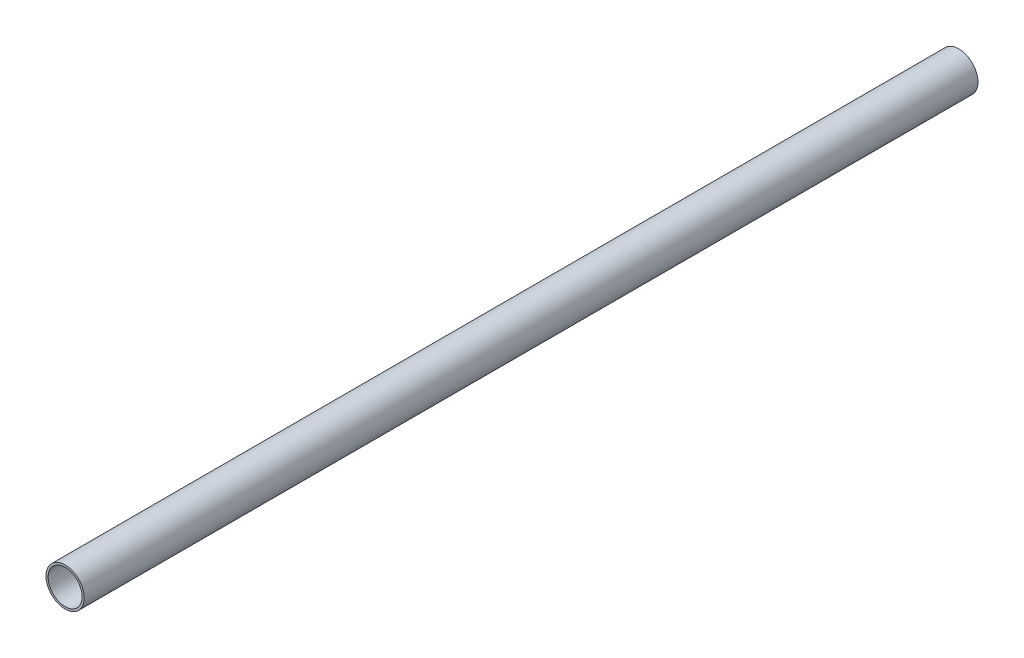
ISO-10303-21;
HEADER;
FILE_DESCRIPTION(('STEP AP214'),'2;1');
FILE_NAME('part.step','',(''),(''),'','','');
FILE_SCHEMA(('AUTOMOTIVE_DESIGN { 1 0 10303 214 1 1 1 1 }'));
ENDSEC;
DATA;
#1=APPLICATION_CONTEXT('core data for automotive mechanical design processes');
#2=APPLICATION_PROTOCOL_DEFINITION('international standard','automotive_design',2000,#1);
#3=PRODUCT_CONTEXT('',#1,'mechanical');
#4=PRODUCT('Part','Part','',(#3));
#5=PRODUCT_RELATED_PRODUCT_CATEGORY('part','',(#4));
#6=PRODUCT_DEFINITION_FORMATION('','',#4);
#7=PRODUCT_DEFINITION_CONTEXT('part definition',#1,'design');
#8=PRODUCT_DEFINITION('design','',#6,#7);
#9=PRODUCT_DEFINITION_SHAPE('','',#8);
#10=(LENGTH_UNIT() NAMED_UNIT(*) SI_UNIT(.MILLI.,.METRE.));
#11=(NAMED_UNIT(*) PLANE_ANGLE_UNIT() SI_UNIT($,.RADIAN.));
#12=(NAMED_UNIT(*) SI_UNIT($,.STERADIAN.) SOLID_ANGLE_UNIT());
#13=UNCERTAINTY_MEASURE_WITH_UNIT(LENGTH_MEASURE(1.E-05),#10,'distance_accuracy_value','');
#14=(GEOMETRIC_REPRESENTATION_CONTEXT(3) GLOBAL_UNCERTAINTY_ASSIGNED_CONTEXT((#13)) GLOBAL_UNIT_ASSIGNED_CONTEXT((#10,
#11,#12)) REPRESENTATION_CONTEXT('',''));
#15=CARTESIAN_POINT('',(0.,0.,0.));
#16=DIRECTION('',(0.,0.,1.));
#17=DIRECTION('',(1.,0.,0.));
#18=AXIS2_PLACEMENT_3D('',#15,#16,#17);
#19=CARTESIAN_POINT('',(0.,0.,420.));
#20=DIRECTION('',(0.,0.,1.));
#21=DIRECTION('',(1.,0.,0.));
#22=AXIS2_PLACEMENT_3D('',#19,#20,#21);
#23=PLANE('',#22);
#24=CARTESIAN_POINT('',(0.,0.,420.));
#25=DIRECTION('',(0.,0.,1.));
#26=DIRECTION('',(1.,0.,0.));
#27=AXIS2_PLACEMENT_3D('',#24,#25,#26);
#28=CIRCLE('',#27,9.);
#29=CARTESIAN_POINT('',(9.,0.,420.));
#30=VERTEX_POINT('',#29);
#31=EDGE_CURVE('E10',#30,#30,#28,.T.);
#32=ORIENTED_EDGE('',*,*,#31,.T.);
#33=EDGE_LOOP('',(#32));
#34=FACE_BOUND('',#33,.T.);
#35=CARTESIAN_POINT('',(0.,0.,420.));
#36=DIRECTION('',(0.,0.,1.));
#37=DIRECTION('',(1.,0.,0.));
#38=AXIS2_PLACEMENT_3D('',#35,#36,#37);
#39=CIRCLE('',#38,8.);
#40=CARTESIAN_POINT('',(8.,0.,420.));
#41=VERTEX_POINT('',#40);
#42=EDGE_CURVE('E41',#41,#41,#39,.T.);
#43=ORIENTED_EDGE('',*,*,#42,.F.);
#44=EDGE_LOOP('',(#43));
#45=FACE_BOUND('',#44,.T.);
#46=ADVANCED_FACE('F30',(#34,#45),#23,.T.);
#47=CARTESIAN_POINT('',(0.,0.,0.));
#48=DIRECTION('',(0.,0.,1.));
#49=DIRECTION('',(1.,0.,0.));
#50=AXIS2_PLACEMENT_3D('',#47,#48,#49);
#51=PLANE('',#50);
#52=CARTESIAN_POINT('',(0.,0.,0.));
#53=DIRECTION('',(0.,0.,1.));
#54=DIRECTION('',(1.,0.,0.));
#55=AXIS2_PLACEMENT_3D('',#52,#53,#54);
#56=CIRCLE('',#55,9.);
#57=CARTESIAN_POINT('',(9.,0.,0.));
#58=VERTEX_POINT('',#57);
#59=EDGE_CURVE('E34',#58,#58,#56,.T.);
#60=ORIENTED_EDGE('',*,*,#59,.F.);
#61=EDGE_LOOP('',(#60));
#62=FACE_BOUND('',#61,.T.);
#63=CARTESIAN_POINT('',(0.,0.,0.));
#64=DIRECTION('',(0.,0.,1.));
#65=DIRECTION('',(1.,0.,0.));
#66=AXIS2_PLACEMENT_3D('',#63,#64,#65);
#67=CIRCLE('',#66,8.);
#68=CARTESIAN_POINT('',(8.,0.,0.));
#69=VERTEX_POINT('',#68);
#70=EDGE_CURVE('E43',#69,#69,#67,.T.);
#71=ORIENTED_EDGE('',*,*,#70,.T.);
#72=EDGE_LOOP('',(#71));
#73=FACE_BOUND('',#72,.T.);
#74=ADVANCED_FACE('F53',(#62,#73),#51,.F.);
#75=CARTESIAN_POINT('',(0.,0.,420.));
#76=DIRECTION('',(0.,0.,-1.));
#77=DIRECTION('',(-1.,0.,0.));
#78=AXIS2_PLACEMENT_3D('',#75,#76,#77);
#79=CYLINDRICAL_SURFACE('',#78,9.);
#80=ORIENTED_EDGE('',*,*,#31,.F.);
#81=EDGE_LOOP('',(#80));
#82=FACE_BOUND('',#81,.T.);
#83=ORIENTED_EDGE('',*,*,#59,.T.);
#84=EDGE_LOOP('',(#83));
#85=FACE_BOUND('',#84,.T.);
#86=ADVANCED_FACE('F32',(#82,#85),#79,.T.);
#87=CARTESIAN_POINT('',(0.,0.,420.));
#88=DIRECTION('',(0.,0.,-1.));
#89=DIRECTION('',(-1.,0.,0.));
#90=AXIS2_PLACEMENT_3D('',#87,#88,#89);
#91=CYLINDRICAL_SURFACE('',#90,8.);
#92=ORIENTED_EDGE('',*,*,#42,.T.);
#93=EDGE_LOOP('',(#92));
#94=FACE_BOUND('',#93,.T.);
#95=ORIENTED_EDGE('',*,*,#70,.F.);
#96=EDGE_LOOP('',(#95));
#97=FACE_BOUND('',#96,.T.);
#98=ADVANCED_FACE('F49',(#94,#97),#91,.F.);
#99=CLOSED_SHELL('',(#46,#74,#86,#98));
#100=MANIFOLD_SOLID_BREP('B2',#99);
#101=ADVANCED_BREP_SHAPE_REPRESENTATION('',(#18,#100),#14);
#102=SHAPE_DEFINITION_REPRESENTATION(#9,#101);
ENDSEC;
END-ISO-10303-21;
